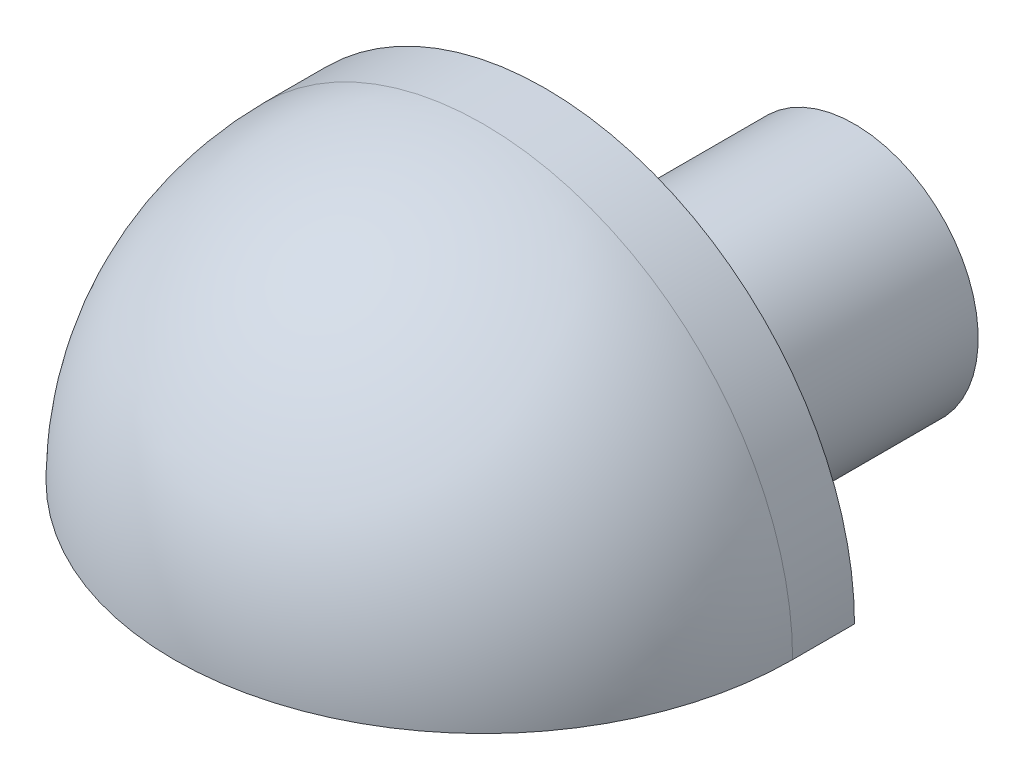
ISO-10303-21;
HEADER;
FILE_DESCRIPTION(('STEP AP214'),'2;1');
FILE_NAME('part.step','',(''),(''),'','','');
FILE_SCHEMA(('AUTOMOTIVE_DESIGN { 1 0 10303 214 1 1 1 1 }'));
ENDSEC;
DATA;
#1=APPLICATION_CONTEXT('core data for automotive mechanical design processes');
#2=APPLICATION_PROTOCOL_DEFINITION('international standard','automotive_design',2000,#1);
#3=PRODUCT_CONTEXT('',#1,'mechanical');
#4=PRODUCT('Part','Part','',(#3));
#5=PRODUCT_RELATED_PRODUCT_CATEGORY('part','',(#4));
#6=PRODUCT_DEFINITION_FORMATION('','',#4);
#7=PRODUCT_DEFINITION_CONTEXT('part definition',#1,'design');
#8=PRODUCT_DEFINITION('design','',#6,#7);
#9=PRODUCT_DEFINITION_SHAPE('','',#8);
#10=(LENGTH_UNIT() NAMED_UNIT(*) SI_UNIT(.MILLI.,.METRE.));
#11=(NAMED_UNIT(*) PLANE_ANGLE_UNIT() SI_UNIT($,.RADIAN.));
#12=(NAMED_UNIT(*) SI_UNIT($,.STERADIAN.) SOLID_ANGLE_UNIT());
#13=UNCERTAINTY_MEASURE_WITH_UNIT(LENGTH_MEASURE(1.E-05),#10,'distance_accuracy_value','');
#14=(GEOMETRIC_REPRESENTATION_CONTEXT(3) GLOBAL_UNCERTAINTY_ASSIGNED_CONTEXT((#13)) GLOBAL_UNIT_ASSIGNED_CONTEXT((#10,
#11,#12)) REPRESENTATION_CONTEXT('',''));
#15=CARTESIAN_POINT('',(0.,0.,0.));
#16=DIRECTION('',(0.,0.,1.));
#17=DIRECTION('',(1.,0.,0.));
#18=AXIS2_PLACEMENT_3D('',#15,#16,#17);
#19=CARTESIAN_POINT('',(-65.787332881609,3.64598414430065,3.));
#20=DIRECTION('',(0.,0.,-1.));
#21=DIRECTION('',(-1.,0.,0.));
#22=AXIS2_PLACEMENT_3D('',#19,#20,#21);
#23=CYLINDRICAL_SURFACE('',#22,15.);
#24=CARTESIAN_POINT('',(-65.787332881609,3.64598414430065,0.));
#25=DIRECTION('',(0.,0.,1.));
#26=DIRECTION('',(-1.,0.,0.));
#27=AXIS2_PLACEMENT_3D('',#24,#25,#26);
#28=CIRCLE('',#27,15.);
#29=CARTESIAN_POINT('',(-50.787332881609,3.64598414430065,0.));
#30=VERTEX_POINT('',#29);
#31=CARTESIAN_POINT('',(-80.787332881609,3.64598414430065,0.));
#32=VERTEX_POINT('',#31);
#33=EDGE_CURVE('E119',#30,#32,#28,.T.);
#34=ORIENTED_EDGE('',*,*,#33,.T.);
#35=DIRECTION('',(0.,0.,-1.));
#36=VECTOR('',#35,1.);
#37=CARTESIAN_POINT('',(-80.787332881609,3.64598414430065,3.));
#38=LINE('',#37,#36);
#39=CARTESIAN_POINT('',(-80.787332881609,3.64598414430065,3.));
#40=VERTEX_POINT('',#39);
#41=EDGE_CURVE('E11',#40,#32,#38,.T.);
#42=ORIENTED_EDGE('',*,*,#41,.F.);
#43=CARTESIAN_POINT('',(-65.787332881609,3.64598414430065,3.));
#44=DIRECTION('',(0.,0.,1.));
#45=DIRECTION('',(-1.,0.,0.));
#46=AXIS2_PLACEMENT_3D('',#43,#44,#45);
#47=CIRCLE('',#46,15.);
#48=CARTESIAN_POINT('',(-50.787332881609,3.64598414430065,3.));
#49=VERTEX_POINT('',#48);
#50=EDGE_CURVE('E96',#49,#40,#47,.T.);
#51=ORIENTED_EDGE('',*,*,#50,.F.);
#52=DIRECTION('',(0.,0.,-1.));
#53=VECTOR('',#52,1.);
#54=CARTESIAN_POINT('',(-50.787332881609,3.64598414430065,3.));
#55=LINE('',#54,#53);
#56=EDGE_CURVE('E42',#49,#30,#55,.T.);
#57=ORIENTED_EDGE('',*,*,#56,.T.);
#58=EDGE_LOOP('',(#34,#42,#51,#57));
#59=FACE_BOUND('',#58,.T.);
#60=ADVANCED_FACE('F33',(#59),#23,.T.);
#61=CARTESIAN_POINT('',(-80.787332881609,3.64598414430065,3.));
#62=DIRECTION('',(0.,1.,0.));
#63=DIRECTION('',(0.,0.,1.));
#64=AXIS2_PLACEMENT_3D('',#61,#62,#63);
#65=PLANE('',#64);
#66=DIRECTION('',(1.,0.,0.));
#67=VECTOR('',#66,1.);
#68=CARTESIAN_POINT('',(-80.787332881609,3.64598414430065,3.));
#69=LINE('',#68,#67);
#70=CARTESIAN_POINT('',(-59.787332881609,3.64598414430065,3.));
#71=VERTEX_POINT('',#70);
#72=CARTESIAN_POINT('',(-52.587332881609,3.64598414430065,3.));
#73=VERTEX_POINT('',#72);
#74=EDGE_CURVE('E36',#71,#73,#69,.T.);
#75=ORIENTED_EDGE('',*,*,#74,.F.);
#76=DIRECTION('',(0.,0.,-1.));
#77=VECTOR('',#76,1.);
#78=CARTESIAN_POINT('',(-59.787332881609,3.64598414430066,3.));
#79=LINE('',#78,#77);
#80=CARTESIAN_POINT('',(-59.787332881609,3.64598414430066,0.));
#81=VERTEX_POINT('',#80);
#82=EDGE_CURVE('E88',#71,#81,#79,.T.);
#83=ORIENTED_EDGE('',*,*,#82,.T.);
#84=DIRECTION('',(1.,0.,0.));
#85=VECTOR('',#84,1.);
#86=CARTESIAN_POINT('',(-80.787332881609,3.64598414430065,0.));
#87=LINE('',#86,#85);
#88=EDGE_CURVE('E97',#81,#30,#87,.T.);
#89=ORIENTED_EDGE('',*,*,#88,.T.);
#90=ORIENTED_EDGE('',*,*,#56,.F.);
#91=CARTESIAN_POINT('',(-65.7873328816091,3.64598414430065,2.99999999999986));
#92=DIRECTION('',(0.,1.,0.));
#93=DIRECTION('',(0.,0.,1.));
#94=AXIS2_PLACEMENT_3D('',#91,#92,#93);
#95=CIRCLE('',#94,15.0000000000001);
#96=EDGE_CURVE('E87',#40,#49,#95,.T.);
#97=ORIENTED_EDGE('',*,*,#96,.F.);
#98=ORIENTED_EDGE('',*,*,#41,.T.);
#99=CARTESIAN_POINT('',(-71.787332881609,3.64598414430066,0.));
#100=VERTEX_POINT('',#99);
#101=EDGE_CURVE('E90',#32,#100,#87,.T.);
#102=ORIENTED_EDGE('',*,*,#101,.T.);
#103=DIRECTION('',(0.,0.,-1.));
#104=VECTOR('',#103,1.);
#105=CARTESIAN_POINT('',(-71.787332881609,3.64598414430064,3.));
#106=LINE('',#105,#104);
#107=CARTESIAN_POINT('',(-71.787332881609,3.64598414430065,3.));
#108=VERTEX_POINT('',#107);
#109=EDGE_CURVE('E56',#108,#100,#106,.T.);
#110=ORIENTED_EDGE('',*,*,#109,.F.);
#111=CARTESIAN_POINT('',(-78.987332881609,3.64598414430065,2.99999999999999));
#112=VERTEX_POINT('',#111);
#113=EDGE_CURVE('E122',#112,#108,#69,.T.);
#114=ORIENTED_EDGE('',*,*,#113,.F.);
#115=CARTESIAN_POINT('',(-65.7873328816093,3.64598414430065,2.99999999999968));
#116=DIRECTION('',(0.,-1.,0.));
#117=DIRECTION('',(0.,0.,1.));
#118=AXIS2_PLACEMENT_3D('',#115,#116,#117);
#119=CIRCLE('',#118,13.2000000000003);
#120=EDGE_CURVE('E115',#73,#112,#119,.T.);
#121=ORIENTED_EDGE('',*,*,#120,.F.);
#122=EDGE_LOOP('',(#75,#83,#89,#90,#97,#98,#102,#110,#114,#121));
#123=FACE_BOUND('',#122,.T.);
#124=ADVANCED_FACE('F91',(#123),#65,.F.);
#125=CARTESIAN_POINT('',(-65.787332881609,3.64598414430065,3.));
#126=DIRECTION('',(0.,0.,-1.));
#127=DIRECTION('',(-1.,0.,0.));
#128=AXIS2_PLACEMENT_3D('',#125,#126,#127);
#129=PLANE('',#128);
#130=CARTESIAN_POINT('',(-65.787332881609,3.64598414430066,3.));
#131=DIRECTION('',(0.,0.,-1.));
#132=DIRECTION('',(-1.,0.,0.));
#133=AXIS2_PLACEMENT_3D('',#130,#131,#132);
#134=CIRCLE('',#133,1.60000000000001);
#135=CARTESIAN_POINT('',(-67.387332881609,3.64598414430066,3.));
#136=VERTEX_POINT('',#135);
#137=EDGE_CURVE('E104',#136,#136,#134,.T.);
#138=ORIENTED_EDGE('',*,*,#137,.T.);
#139=EDGE_LOOP('',(#138));
#140=FACE_BOUND('',#139,.T.);
#141=ORIENTED_EDGE('',*,*,#113,.T.);
#142=CARTESIAN_POINT('',(-65.787332881609,3.64598414430066,3.));
#143=DIRECTION('',(0.,0.,-1.));
#144=DIRECTION('',(1.,0.,0.));
#145=AXIS2_PLACEMENT_3D('',#142,#143,#144);
#146=CIRCLE('',#145,6.);
#147=EDGE_CURVE('E86',#71,#108,#146,.T.);
#148=ORIENTED_EDGE('',*,*,#147,.F.);
#149=ORIENTED_EDGE('',*,*,#74,.T.);
#150=CARTESIAN_POINT('',(-65.787332881609,3.64598414430065,2.99999999999999));
#151=DIRECTION('',(0.,0.,1.));
#152=DIRECTION('',(1.,0.,0.));
#153=AXIS2_PLACEMENT_3D('',#150,#151,#152);
#154=CIRCLE('',#153,13.2);
#155=EDGE_CURVE('E127',#73,#112,#154,.T.);
#156=ORIENTED_EDGE('',*,*,#155,.T.);
#157=EDGE_LOOP('',(#141,#148,#149,#156));
#158=FACE_BOUND('',#157,.T.);
#159=ADVANCED_FACE('F149',(#140,#158),#129,.F.);
#160=CARTESIAN_POINT('',(-65.787332881609,3.64598414430065,0.));
#161=DIRECTION('',(0.,0.,-1.));
#162=DIRECTION('',(-1.,0.,0.));
#163=AXIS2_PLACEMENT_3D('',#160,#161,#162);
#164=PLANE('',#163);
#165=CARTESIAN_POINT('',(-65.787332881609,3.64598414430066,0.));
#166=DIRECTION('',(0.,0.,-1.));
#167=DIRECTION('',(-1.,0.,0.));
#168=AXIS2_PLACEMENT_3D('',#165,#166,#167);
#169=CIRCLE('',#168,6.);
#170=EDGE_CURVE('E84',#100,#81,#169,.T.);
#171=ORIENTED_EDGE('',*,*,#170,.F.);
#172=ORIENTED_EDGE('',*,*,#101,.F.);
#173=ORIENTED_EDGE('',*,*,#33,.F.);
#174=ORIENTED_EDGE('',*,*,#88,.F.);
#175=EDGE_LOOP('',(#171,#172,#173,#174));
#176=FACE_BOUND('',#175,.T.);
#177=ADVANCED_FACE('F99',(#176),#164,.T.);
#178=CARTESIAN_POINT('',(-65.7873328816091,3.64598414430065,2.99999999999986));
#179=DIRECTION('',(0.,0.,1.));
#180=DIRECTION('',(1.,0.,0.));
#181=AXIS2_PLACEMENT_3D('',#178,#179,#180);
#182=SPHERICAL_SURFACE('',#181,15.0000000000001);
#183=ORIENTED_EDGE('',*,*,#50,.T.);
#184=ORIENTED_EDGE('',*,*,#96,.T.);
#185=EDGE_LOOP('',(#183,#184));
#186=FACE_BOUND('',#185,.T.);
#187=ADVANCED_FACE('F138',(#186),#182,.T.);
#188=CARTESIAN_POINT('',(-65.7873328816093,3.64598414430065,2.99999999999968));
#189=DIRECTION('',(0.,0.,1.));
#190=DIRECTION('',(1.,0.,0.));
#191=AXIS2_PLACEMENT_3D('',#188,#189,#190);
#192=SPHERICAL_SURFACE('',#191,13.2000000000003);
#193=ORIENTED_EDGE('',*,*,#155,.F.);
#194=ORIENTED_EDGE('',*,*,#120,.T.);
#195=EDGE_LOOP('',(#193,#194));
#196=FACE_BOUND('',#195,.T.);
#197=ADVANCED_FACE('F140',(#196),#192,.F.);
#198=CARTESIAN_POINT('',(-65.787332881609,3.64598414430066,3.));
#199=DIRECTION('',(0.,0.,-1.));
#200=DIRECTION('',(-1.,0.,0.));
#201=AXIS2_PLACEMENT_3D('',#198,#199,#200);
#202=CYLINDRICAL_SURFACE('',#201,6.);
#203=ORIENTED_EDGE('',*,*,#109,.T.);
#204=ORIENTED_EDGE('',*,*,#170,.T.);
#205=ORIENTED_EDGE('',*,*,#82,.F.);
#206=ORIENTED_EDGE('',*,*,#147,.T.);
#207=EDGE_LOOP('',(#203,#204,#205,#206));
#208=FACE_BOUND('',#207,.T.);
#209=CARTESIAN_POINT('',(-65.787332881609,3.64598414430066,-15.));
#210=DIRECTION('',(0.,0.,-1.));
#211=DIRECTION('',(-1.,0.,0.));
#212=AXIS2_PLACEMENT_3D('',#209,#210,#211);
#213=CIRCLE('',#212,6.);
#214=CARTESIAN_POINT('',(-71.787332881609,3.64598414430066,-15.));
#215=VERTEX_POINT('',#214);
#216=EDGE_CURVE('E100',#215,#215,#213,.T.);
#217=ORIENTED_EDGE('',*,*,#216,.F.);
#218=EDGE_LOOP('',(#217));
#219=FACE_BOUND('',#218,.T.);
#220=ADVANCED_FACE('F81',(#208,#219),#202,.T.);
#221=CARTESIAN_POINT('',(-65.787332881609,3.64598414430066,3.));
#222=DIRECTION('',(0.,0.,-1.));
#223=DIRECTION('',(-1.,0.,0.));
#224=AXIS2_PLACEMENT_3D('',#221,#222,#223);
#225=CYLINDRICAL_SURFACE('',#224,1.60000000000001);
#226=ORIENTED_EDGE('',*,*,#137,.F.);
#227=EDGE_LOOP('',(#226));
#228=FACE_BOUND('',#227,.T.);
#229=CARTESIAN_POINT('',(-65.787332881609,3.64598414430066,-15.));
#230=DIRECTION('',(0.,0.,-1.));
#231=DIRECTION('',(-1.,0.,0.));
#232=AXIS2_PLACEMENT_3D('',#229,#230,#231);
#233=CIRCLE('',#232,1.60000000000001);
#234=CARTESIAN_POINT('',(-67.387332881609,3.64598414430066,-15.));
#235=VERTEX_POINT('',#234);
#236=EDGE_CURVE('E101',#235,#235,#233,.T.);
#237=ORIENTED_EDGE('',*,*,#236,.T.);
#238=EDGE_LOOP('',(#237));
#239=FACE_BOUND('',#238,.T.);
#240=ADVANCED_FACE('F165',(#228,#239),#225,.F.);
#241=CARTESIAN_POINT('',(-65.787332881609,3.64598414430066,-15.));
#242=DIRECTION('',(0.,0.,-1.));
#243=DIRECTION('',(-1.,0.,0.));
#244=AXIS2_PLACEMENT_3D('',#241,#242,#243);
#245=PLANE('',#244);
#246=ORIENTED_EDGE('',*,*,#216,.T.);
#247=EDGE_LOOP('',(#246));
#248=FACE_BOUND('',#247,.T.);
#249=ORIENTED_EDGE('',*,*,#236,.F.);
#250=EDGE_LOOP('',(#249));
#251=FACE_BOUND('',#250,.T.);
#252=ADVANCED_FACE('F168',(#248,#251),#245,.T.);
#253=CLOSED_SHELL('',(#60,#124,#159,#177,#187,#197,#220,#240,#252));
#254=MANIFOLD_SOLID_BREP('B2',#253);
#255=ADVANCED_BREP_SHAPE_REPRESENTATION('',(#18,#254),#14);
#256=SHAPE_DEFINITION_REPRESENTATION(#9,#255);
ENDSEC;
END-ISO-10303-21;
